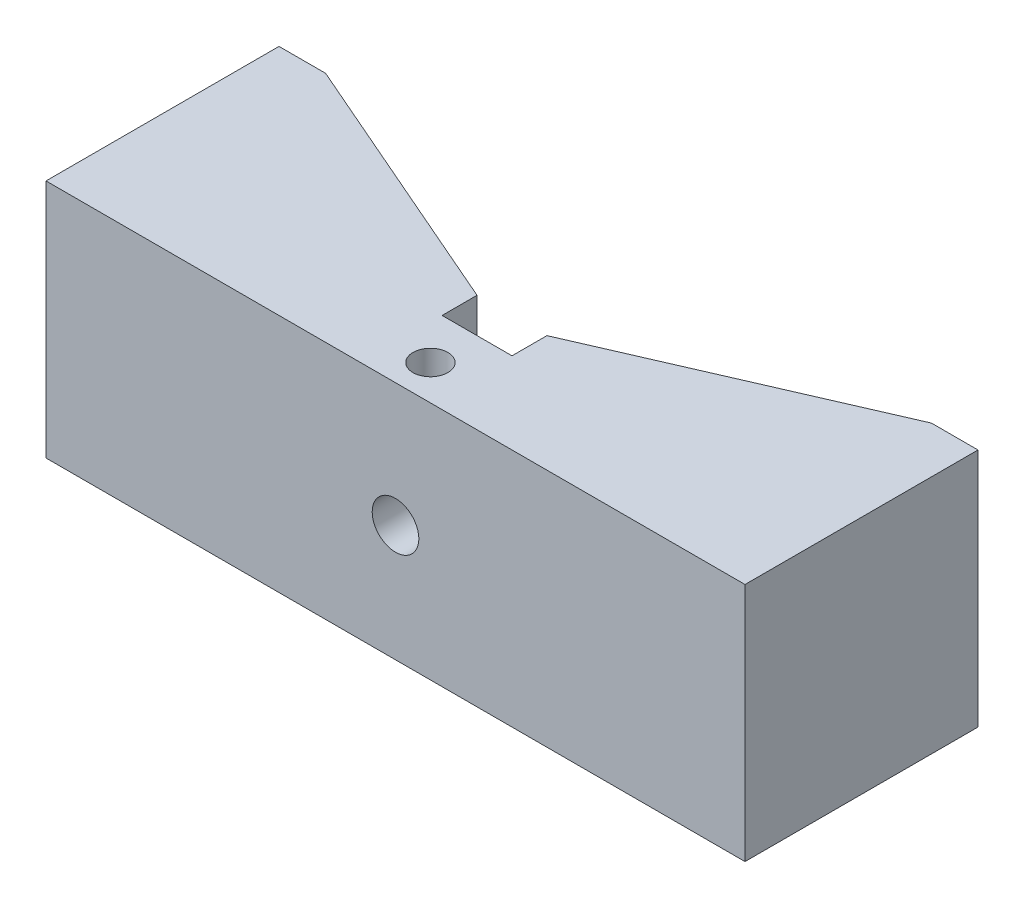
ISO-10303-21;
HEADER;
FILE_DESCRIPTION(('STEP AP214'),'2;1');
FILE_NAME('part.step','',(''),(''),'','','');
FILE_SCHEMA(('AUTOMOTIVE_DESIGN { 1 0 10303 214 1 1 1 1 }'));
ENDSEC;
DATA;
#1=APPLICATION_CONTEXT('core data for automotive mechanical design processes');
#2=APPLICATION_PROTOCOL_DEFINITION('international standard','automotive_design',2000,#1);
#3=PRODUCT_CONTEXT('',#1,'mechanical');
#4=PRODUCT('Part','Part','',(#3));
#5=PRODUCT_RELATED_PRODUCT_CATEGORY('part','',(#4));
#6=PRODUCT_DEFINITION_FORMATION('','',#4);
#7=PRODUCT_DEFINITION_CONTEXT('part definition',#1,'design');
#8=PRODUCT_DEFINITION('design','',#6,#7);
#9=PRODUCT_DEFINITION_SHAPE('','',#8);
#10=(LENGTH_UNIT() NAMED_UNIT(*) SI_UNIT(.MILLI.,.METRE.));
#11=(NAMED_UNIT(*) PLANE_ANGLE_UNIT() SI_UNIT($,.RADIAN.));
#12=(NAMED_UNIT(*) SI_UNIT($,.STERADIAN.) SOLID_ANGLE_UNIT());
#13=UNCERTAINTY_MEASURE_WITH_UNIT(LENGTH_MEASURE(1.E-05),#10,'distance_accuracy_value','');
#14=(GEOMETRIC_REPRESENTATION_CONTEXT(3) GLOBAL_UNCERTAINTY_ASSIGNED_CONTEXT((#13)) GLOBAL_UNIT_ASSIGNED_CONTEXT((#10,
#11,#12)) REPRESENTATION_CONTEXT('',''));
#15=CARTESIAN_POINT('',(0.,0.,0.));
#16=DIRECTION('',(0.,0.,1.));
#17=DIRECTION('',(1.,0.,0.));
#18=AXIS2_PLACEMENT_3D('',#15,#16,#17);
#19=CARTESIAN_POINT('',(-33.02,26.162,-12.7));
#20=DIRECTION('',(0.,0.,1.));
#21=DIRECTION('',(1.,0.,0.));
#22=AXIS2_PLACEMENT_3D('',#19,#20,#21);
#23=PLANE('',#22);
#24=DIRECTION('',(-1.,0.,0.));
#25=VECTOR('',#24,1.);
#26=CARTESIAN_POINT('',(-33.02,0.,-12.7));
#27=LINE('',#26,#25);
#28=CARTESIAN_POINT('',(-33.02,0.,-12.7));
#29=VERTEX_POINT('',#28);
#30=CARTESIAN_POINT('',(-38.1,0.,-12.7));
#31=VERTEX_POINT('',#30);
#32=EDGE_CURVE('E140',#29,#31,#27,.T.);
#33=ORIENTED_EDGE('',*,*,#32,.T.);
#34=DIRECTION('',(0.,-1.,0.));
#35=VECTOR('',#34,1.);
#36=CARTESIAN_POINT('',(-38.1,26.162,-12.7));
#37=LINE('',#36,#35);
#38=CARTESIAN_POINT('',(-38.1,26.162,-12.7));
#39=VERTEX_POINT('',#38);
#40=EDGE_CURVE('E11',#39,#31,#37,.T.);
#41=ORIENTED_EDGE('',*,*,#40,.F.);
#42=DIRECTION('',(-1.,0.,0.));
#43=VECTOR('',#42,1.);
#44=CARTESIAN_POINT('',(-33.02,26.162,-12.7));
#45=LINE('',#44,#43);
#46=CARTESIAN_POINT('',(-33.02,26.162,-12.7));
#47=VERTEX_POINT('',#46);
#48=EDGE_CURVE('E159',#47,#39,#45,.T.);
#49=ORIENTED_EDGE('',*,*,#48,.F.);
#50=DIRECTION('',(0.,-1.,0.));
#51=VECTOR('',#50,1.);
#52=CARTESIAN_POINT('',(-33.02,26.162,-12.7));
#53=LINE('',#52,#51);
#54=EDGE_CURVE('E136',#47,#29,#53,.T.);
#55=ORIENTED_EDGE('',*,*,#54,.T.);
#56=EDGE_LOOP('',(#33,#41,#49,#55));
#57=FACE_BOUND('',#56,.T.);
#58=ADVANCED_FACE('F32',(#57),#23,.F.);
#59=CARTESIAN_POINT('',(-38.1,26.162,12.7));
#60=DIRECTION('',(1.,0.,0.));
#61=DIRECTION('',(0.,0.,-1.));
#62=AXIS2_PLACEMENT_3D('',#59,#60,#61);
#63=PLANE('',#62);
#64=DIRECTION('',(0.,0.,1.));
#65=VECTOR('',#64,1.);
#66=CARTESIAN_POINT('',(-38.1,0.,12.7));
#67=LINE('',#66,#65);
#68=CARTESIAN_POINT('',(-38.1,0.,12.7));
#69=VERTEX_POINT('',#68);
#70=EDGE_CURVE('E143',#31,#69,#67,.T.);
#71=ORIENTED_EDGE('',*,*,#70,.T.);
#72=DIRECTION('',(0.,-1.,0.));
#73=VECTOR('',#72,1.);
#74=CARTESIAN_POINT('',(-38.1,26.162,12.7));
#75=LINE('',#74,#73);
#76=CARTESIAN_POINT('',(-38.1,26.162,12.7));
#77=VERTEX_POINT('',#76);
#78=EDGE_CURVE('E40',#77,#69,#75,.T.);
#79=ORIENTED_EDGE('',*,*,#78,.F.);
#80=DIRECTION('',(0.,0.,1.));
#81=VECTOR('',#80,1.);
#82=CARTESIAN_POINT('',(-38.1,26.162,12.7));
#83=LINE('',#82,#81);
#84=EDGE_CURVE('E97',#39,#77,#83,.T.);
#85=ORIENTED_EDGE('',*,*,#84,.F.);
#86=ORIENTED_EDGE('',*,*,#40,.T.);
#87=EDGE_LOOP('',(#71,#79,#85,#86));
#88=FACE_BOUND('',#87,.T.);
#89=ADVANCED_FACE('F239',(#88),#63,.F.);
#90=CARTESIAN_POINT('',(38.1,26.162,12.7));
#91=DIRECTION('',(0.,0.,-1.));
#92=DIRECTION('',(-1.,0.,0.));
#93=AXIS2_PLACEMENT_3D('',#90,#91,#92);
#94=PLANE('',#93);
#95=CARTESIAN_POINT('',(0.,12.7,12.7));
#96=DIRECTION('',(0.,0.,-1.));
#97=DIRECTION('',(-1.,0.,0.));
#98=AXIS2_PLACEMENT_3D('',#95,#96,#97);
#99=CIRCLE('',#98,2.54);
#100=CARTESIAN_POINT('',(-2.54,12.7,12.7));
#101=VERTEX_POINT('',#100);
#102=EDGE_CURVE('E209',#101,#101,#99,.T.);
#103=ORIENTED_EDGE('',*,*,#102,.T.);
#104=EDGE_LOOP('',(#103));
#105=FACE_BOUND('',#104,.T.);
#106=DIRECTION('',(1.,0.,0.));
#107=VECTOR('',#106,1.);
#108=CARTESIAN_POINT('',(38.1,0.,12.7));
#109=LINE('',#108,#107);
#110=CARTESIAN_POINT('',(38.1,0.,12.7));
#111=VERTEX_POINT('',#110);
#112=EDGE_CURVE('E146',#69,#111,#109,.T.);
#113=ORIENTED_EDGE('',*,*,#112,.T.);
#114=DIRECTION('',(0.,-1.,0.));
#115=VECTOR('',#114,1.);
#116=CARTESIAN_POINT('',(38.1,26.162,12.7));
#117=LINE('',#116,#115);
#118=CARTESIAN_POINT('',(38.1,26.162,12.7));
#119=VERTEX_POINT('',#118);
#120=EDGE_CURVE('E172',#119,#111,#117,.T.);
#121=ORIENTED_EDGE('',*,*,#120,.F.);
#122=DIRECTION('',(1.,0.,0.));
#123=VECTOR('',#122,1.);
#124=CARTESIAN_POINT('',(38.1,26.162,12.7));
#125=LINE('',#124,#123);
#126=EDGE_CURVE('E180',#77,#119,#125,.T.);
#127=ORIENTED_EDGE('',*,*,#126,.F.);
#128=ORIENTED_EDGE('',*,*,#78,.T.);
#129=EDGE_LOOP('',(#113,#121,#127,#128));
#130=FACE_BOUND('',#129,.T.);
#131=ADVANCED_FACE('F178',(#105,#130),#94,.F.);
#132=CARTESIAN_POINT('',(38.1,26.162,12.7));
#133=DIRECTION('',(-1.,0.,0.));
#134=DIRECTION('',(0.,0.,1.));
#135=AXIS2_PLACEMENT_3D('',#132,#133,#134);
#136=PLANE('',#135);
#137=DIRECTION('',(0.,0.,-1.));
#138=VECTOR('',#137,1.);
#139=CARTESIAN_POINT('',(38.1,0.,12.7));
#140=LINE('',#139,#138);
#141=CARTESIAN_POINT('',(38.1,0.,-12.7));
#142=VERTEX_POINT('',#141);
#143=EDGE_CURVE('E148',#111,#142,#140,.T.);
#144=ORIENTED_EDGE('',*,*,#143,.T.);
#145=DIRECTION('',(0.,-1.,0.));
#146=VECTOR('',#145,1.);
#147=CARTESIAN_POINT('',(38.1,26.162,-12.7));
#148=LINE('',#147,#146);
#149=CARTESIAN_POINT('',(38.1,26.162,-12.7));
#150=VERTEX_POINT('',#149);
#151=EDGE_CURVE('E169',#150,#142,#148,.T.);
#152=ORIENTED_EDGE('',*,*,#151,.F.);
#153=DIRECTION('',(0.,0.,-1.));
#154=VECTOR('',#153,1.);
#155=CARTESIAN_POINT('',(38.1,26.162,12.7));
#156=LINE('',#155,#154);
#157=EDGE_CURVE('E198',#119,#150,#156,.T.);
#158=ORIENTED_EDGE('',*,*,#157,.F.);
#159=ORIENTED_EDGE('',*,*,#120,.T.);
#160=EDGE_LOOP('',(#144,#152,#158,#159));
#161=FACE_BOUND('',#160,.T.);
#162=ADVANCED_FACE('F189',(#161),#136,.F.);
#163=CARTESIAN_POINT('',(38.1,26.162,-12.7));
#164=DIRECTION('',(0.,0.,1.));
#165=DIRECTION('',(1.,0.,0.));
#166=AXIS2_PLACEMENT_3D('',#163,#164,#165);
#167=PLANE('',#166);
#168=DIRECTION('',(-1.,0.,0.));
#169=VECTOR('',#168,1.);
#170=CARTESIAN_POINT('',(38.1,0.,-12.7));
#171=LINE('',#170,#169);
#172=CARTESIAN_POINT('',(33.02,0.,-12.7));
#173=VERTEX_POINT('',#172);
#174=EDGE_CURVE('E150',#142,#173,#171,.T.);
#175=ORIENTED_EDGE('',*,*,#174,.T.);
#176=DIRECTION('',(0.,-1.,0.));
#177=VECTOR('',#176,1.);
#178=CARTESIAN_POINT('',(33.02,26.162,-12.7));
#179=LINE('',#178,#177);
#180=CARTESIAN_POINT('',(33.02,26.162,-12.7));
#181=VERTEX_POINT('',#180);
#182=EDGE_CURVE('E166',#181,#173,#179,.T.);
#183=ORIENTED_EDGE('',*,*,#182,.F.);
#184=DIRECTION('',(-1.,0.,0.));
#185=VECTOR('',#184,1.);
#186=CARTESIAN_POINT('',(38.1,26.162,-12.7));
#187=LINE('',#186,#185);
#188=EDGE_CURVE('E195',#150,#181,#187,.T.);
#189=ORIENTED_EDGE('',*,*,#188,.F.);
#190=ORIENTED_EDGE('',*,*,#151,.T.);
#191=EDGE_LOOP('',(#175,#183,#189,#190));
#192=FACE_BOUND('',#191,.T.);
#193=ADVANCED_FACE('F193',(#192),#167,.F.);
#194=CARTESIAN_POINT('',(33.02,26.162,-12.7));
#195=DIRECTION('',(0.39872611141445,0.,0.917070056253235));
#196=DIRECTION('',(0.917070056253235,0.,-0.39872611141445));
#197=AXIS2_PLACEMENT_3D('',#194,#195,#196);
#198=PLANE('',#197);
#199=DIRECTION('',(-0.917070056253235,0.,0.39872611141445));
#200=VECTOR('',#199,1.);
#201=CARTESIAN_POINT('',(33.02,0.,-12.7));
#202=LINE('',#201,#200);
#203=CARTESIAN_POINT('',(3.81000000000001,0.,0.));
#204=VERTEX_POINT('',#203);
#205=EDGE_CURVE('E152',#173,#204,#202,.T.);
#206=ORIENTED_EDGE('',*,*,#205,.T.);
#207=DIRECTION('',(0.,-1.,0.));
#208=VECTOR('',#207,1.);
#209=CARTESIAN_POINT('',(3.81000000000001,26.162,0.));
#210=LINE('',#209,#208);
#211=CARTESIAN_POINT('',(3.81000000000001,26.162,0.));
#212=VERTEX_POINT('',#211);
#213=EDGE_CURVE('E163',#212,#204,#210,.T.);
#214=ORIENTED_EDGE('',*,*,#213,.F.);
#215=DIRECTION('',(-0.917070056253235,0.,0.39872611141445));
#216=VECTOR('',#215,1.);
#217=CARTESIAN_POINT('',(33.02,26.162,-12.7));
#218=LINE('',#217,#216);
#219=EDGE_CURVE('E197',#181,#212,#218,.T.);
#220=ORIENTED_EDGE('',*,*,#219,.F.);
#221=ORIENTED_EDGE('',*,*,#182,.T.);
#222=EDGE_LOOP('',(#206,#214,#220,#221));
#223=FACE_BOUND('',#222,.T.);
#224=ADVANCED_FACE('F235',(#223),#198,.F.);
#225=CARTESIAN_POINT('',(3.81,26.162,3.81));
#226=DIRECTION('',(1.,0.,0.));
#227=DIRECTION('',(0.,0.,-1.));
#228=AXIS2_PLACEMENT_3D('',#225,#226,#227);
#229=PLANE('',#228);
#230=DIRECTION('',(0.,0.,1.));
#231=VECTOR('',#230,1.);
#232=CARTESIAN_POINT('',(3.81,0.,3.81));
#233=LINE('',#232,#231);
#234=CARTESIAN_POINT('',(3.81,0.,3.81));
#235=VERTEX_POINT('',#234);
#236=EDGE_CURVE('E154',#204,#235,#233,.T.);
#237=ORIENTED_EDGE('',*,*,#236,.T.);
#238=DIRECTION('',(0.,-1.,0.));
#239=VECTOR('',#238,1.);
#240=CARTESIAN_POINT('',(3.81,26.162,3.81));
#241=LINE('',#240,#239);
#242=CARTESIAN_POINT('',(3.81,26.162,3.81));
#243=VERTEX_POINT('',#242);
#244=EDGE_CURVE('E131',#243,#235,#241,.T.);
#245=ORIENTED_EDGE('',*,*,#244,.F.);
#246=DIRECTION('',(0.,0.,1.));
#247=VECTOR('',#246,1.);
#248=CARTESIAN_POINT('',(3.81,26.162,3.81));
#249=LINE('',#248,#247);
#250=EDGE_CURVE('E122',#212,#243,#249,.T.);
#251=ORIENTED_EDGE('',*,*,#250,.F.);
#252=ORIENTED_EDGE('',*,*,#213,.T.);
#253=EDGE_LOOP('',(#237,#245,#251,#252));
#254=FACE_BOUND('',#253,.T.);
#255=ADVANCED_FACE('F227',(#254),#229,.F.);
#256=CARTESIAN_POINT('',(-3.81,26.162,3.81));
#257=DIRECTION('',(0.,0.,1.));
#258=DIRECTION('',(1.,0.,0.));
#259=AXIS2_PLACEMENT_3D('',#256,#257,#258);
#260=PLANE('',#259);
#261=CARTESIAN_POINT('',(0.,12.7,3.81));
#262=DIRECTION('',(0.,0.,-1.));
#263=DIRECTION('',(-1.,0.,0.));
#264=AXIS2_PLACEMENT_3D('',#261,#262,#263);
#265=CIRCLE('',#264,2.54);
#266=CARTESIAN_POINT('',(-2.54,12.7,3.81));
#267=VERTEX_POINT('',#266);
#268=EDGE_CURVE('E212',#267,#267,#265,.T.);
#269=ORIENTED_EDGE('',*,*,#268,.F.);
#270=EDGE_LOOP('',(#269));
#271=FACE_BOUND('',#270,.T.);
#272=DIRECTION('',(-1.,0.,0.));
#273=VECTOR('',#272,1.);
#274=CARTESIAN_POINT('',(-3.81,0.,3.81));
#275=LINE('',#274,#273);
#276=CARTESIAN_POINT('',(-3.81,0.,3.81));
#277=VERTEX_POINT('',#276);
#278=EDGE_CURVE('E130',#235,#277,#275,.T.);
#279=ORIENTED_EDGE('',*,*,#278,.T.);
#280=DIRECTION('',(0.,-1.,0.));
#281=VECTOR('',#280,1.);
#282=CARTESIAN_POINT('',(-3.81,26.162,3.81));
#283=LINE('',#282,#281);
#284=CARTESIAN_POINT('',(-3.81,26.162,3.81));
#285=VERTEX_POINT('',#284);
#286=EDGE_CURVE('E127',#285,#277,#283,.T.);
#287=ORIENTED_EDGE('',*,*,#286,.F.);
#288=DIRECTION('',(-1.,0.,0.));
#289=VECTOR('',#288,1.);
#290=CARTESIAN_POINT('',(-3.81,26.162,3.81));
#291=LINE('',#290,#289);
#292=EDGE_CURVE('E116',#243,#285,#291,.T.);
#293=ORIENTED_EDGE('',*,*,#292,.F.);
#294=ORIENTED_EDGE('',*,*,#244,.T.);
#295=EDGE_LOOP('',(#279,#287,#293,#294));
#296=FACE_BOUND('',#295,.T.);
#297=ADVANCED_FACE('F128',(#271,#296),#260,.F.);
#298=CARTESIAN_POINT('',(-3.81,26.162,0.));
#299=DIRECTION('',(-1.,0.,0.));
#300=DIRECTION('',(0.,0.,1.));
#301=AXIS2_PLACEMENT_3D('',#298,#299,#300);
#302=PLANE('',#301);
#303=DIRECTION('',(0.,0.,-1.));
#304=VECTOR('',#303,1.);
#305=CARTESIAN_POINT('',(-3.81,0.,0.));
#306=LINE('',#305,#304);
#307=CARTESIAN_POINT('',(-3.81,0.,0.));
#308=VERTEX_POINT('',#307);
#309=EDGE_CURVE('E83',#277,#308,#306,.T.);
#310=ORIENTED_EDGE('',*,*,#309,.T.);
#311=DIRECTION('',(0.,-1.,0.));
#312=VECTOR('',#311,1.);
#313=CARTESIAN_POINT('',(-3.81,26.162,0.));
#314=LINE('',#313,#312);
#315=CARTESIAN_POINT('',(-3.81,26.162,0.));
#316=VERTEX_POINT('',#315);
#317=EDGE_CURVE('E132',#316,#308,#314,.T.);
#318=ORIENTED_EDGE('',*,*,#317,.F.);
#319=DIRECTION('',(0.,0.,-1.));
#320=VECTOR('',#319,1.);
#321=CARTESIAN_POINT('',(-3.81,26.162,0.));
#322=LINE('',#321,#320);
#323=EDGE_CURVE('E120',#285,#316,#322,.T.);
#324=ORIENTED_EDGE('',*,*,#323,.F.);
#325=ORIENTED_EDGE('',*,*,#286,.T.);
#326=EDGE_LOOP('',(#310,#318,#324,#325));
#327=FACE_BOUND('',#326,.T.);
#328=ADVANCED_FACE('F134',(#327),#302,.F.);
#329=CARTESIAN_POINT('',(-33.02,26.162,-12.7));
#330=DIRECTION('',(-0.39872611141445,0.,0.917070056253235));
#331=DIRECTION('',(0.917070056253235,0.,0.39872611141445));
#332=AXIS2_PLACEMENT_3D('',#329,#330,#331);
#333=PLANE('',#332);
#334=DIRECTION('',(-0.917070056253235,0.,-0.39872611141445));
#335=VECTOR('',#334,1.);
#336=CARTESIAN_POINT('',(-33.02,0.,-12.7));
#337=LINE('',#336,#335);
#338=EDGE_CURVE('E89',#308,#29,#337,.T.);
#339=ORIENTED_EDGE('',*,*,#338,.T.);
#340=ORIENTED_EDGE('',*,*,#54,.F.);
#341=DIRECTION('',(-0.917070056253235,0.,-0.39872611141445));
#342=VECTOR('',#341,1.);
#343=CARTESIAN_POINT('',(-33.02,26.162,-12.7));
#344=LINE('',#343,#342);
#345=EDGE_CURVE('E48',#316,#47,#344,.T.);
#346=ORIENTED_EDGE('',*,*,#345,.F.);
#347=ORIENTED_EDGE('',*,*,#317,.T.);
#348=EDGE_LOOP('',(#339,#340,#346,#347));
#349=FACE_BOUND('',#348,.T.);
#350=ADVANCED_FACE('F233',(#349),#333,.F.);
#351=CARTESIAN_POINT('',(0.,26.162,0.));
#352=DIRECTION('',(0.,-1.,0.));
#353=DIRECTION('',(0.,0.,-1.));
#354=AXIS2_PLACEMENT_3D('',#351,#352,#353);
#355=PLANE('',#354);
#356=CARTESIAN_POINT('',(0.,26.162,8.89));
#357=DIRECTION('',(0.,1.,0.));
#358=DIRECTION('',(0.,0.,1.));
#359=AXIS2_PLACEMENT_3D('',#356,#357,#358);
#360=CIRCLE('',#359,1.905);
#361=CARTESIAN_POINT('',(0.,26.162,10.795));
#362=VERTEX_POINT('',#361);
#363=EDGE_CURVE('E206',#362,#362,#360,.T.);
#364=ORIENTED_EDGE('',*,*,#363,.F.);
#365=EDGE_LOOP('',(#364));
#366=FACE_BOUND('',#365,.T.);
#367=ORIENTED_EDGE('',*,*,#48,.T.);
#368=ORIENTED_EDGE('',*,*,#84,.T.);
#369=ORIENTED_EDGE('',*,*,#126,.T.);
#370=ORIENTED_EDGE('',*,*,#157,.T.);
#371=ORIENTED_EDGE('',*,*,#188,.T.);
#372=ORIENTED_EDGE('',*,*,#219,.T.);
#373=ORIENTED_EDGE('',*,*,#250,.T.);
#374=ORIENTED_EDGE('',*,*,#292,.T.);
#375=ORIENTED_EDGE('',*,*,#323,.T.);
#376=ORIENTED_EDGE('',*,*,#345,.T.);
#377=EDGE_LOOP('',(#367,#368,#369,#370,#371,#372,#373,#374,#375,#376));
#378=FACE_BOUND('',#377,.T.);
#379=ADVANCED_FACE('F118',(#366,#378),#355,.F.);
#380=CARTESIAN_POINT('',(0.,0.,0.));
#381=DIRECTION('',(0.,-1.,0.));
#382=DIRECTION('',(0.,0.,-1.));
#383=AXIS2_PLACEMENT_3D('',#380,#381,#382);
#384=PLANE('',#383);
#385=ORIENTED_EDGE('',*,*,#32,.F.);
#386=ORIENTED_EDGE('',*,*,#338,.F.);
#387=ORIENTED_EDGE('',*,*,#309,.F.);
#388=ORIENTED_EDGE('',*,*,#278,.F.);
#389=ORIENTED_EDGE('',*,*,#236,.F.);
#390=ORIENTED_EDGE('',*,*,#205,.F.);
#391=ORIENTED_EDGE('',*,*,#174,.F.);
#392=ORIENTED_EDGE('',*,*,#143,.F.);
#393=ORIENTED_EDGE('',*,*,#112,.F.);
#394=ORIENTED_EDGE('',*,*,#70,.F.);
#395=EDGE_LOOP('',(#385,#386,#387,#388,#389,#390,#391,#392,#393,#394));
#396=FACE_BOUND('',#395,.T.);
#397=ADVANCED_FACE('F184',(#396),#384,.T.);
#398=CARTESIAN_POINT('',(0.,21.082,8.89));
#399=DIRECTION('',(0.,1.,0.));
#400=DIRECTION('',(0.,0.,1.));
#401=AXIS2_PLACEMENT_3D('',#398,#399,#400);
#402=CYLINDRICAL_SURFACE('',#401,1.905);
#403=CARTESIAN_POINT('',(0.,21.082,8.89));
#404=DIRECTION('',(0.,1.,0.));
#405=DIRECTION('',(0.,0.,1.));
#406=AXIS2_PLACEMENT_3D('',#403,#404,#405);
#407=CIRCLE('',#406,1.905);
#408=CARTESIAN_POINT('',(0.,21.082,10.795));
#409=VERTEX_POINT('',#408);
#410=EDGE_CURVE('E144',#409,#409,#407,.T.);
#411=ORIENTED_EDGE('',*,*,#410,.F.);
#412=EDGE_LOOP('',(#411));
#413=FACE_BOUND('',#412,.T.);
#414=ORIENTED_EDGE('',*,*,#363,.T.);
#415=EDGE_LOOP('',(#414));
#416=FACE_BOUND('',#415,.T.);
#417=ADVANCED_FACE('F308',(#413,#416),#402,.F.);
#418=CARTESIAN_POINT('',(0.,21.082,8.89));
#419=DIRECTION('',(0.,1.,0.));
#420=DIRECTION('',(0.,0.,1.));
#421=AXIS2_PLACEMENT_3D('',#418,#419,#420);
#422=PLANE('',#421);
#423=ORIENTED_EDGE('',*,*,#410,.T.);
#424=EDGE_LOOP('',(#423));
#425=FACE_BOUND('',#424,.T.);
#426=ADVANCED_FACE('F222',(#425),#422,.T.);
#427=CARTESIAN_POINT('',(0.,12.7,12.7));
#428=DIRECTION('',(0.,0.,-1.));
#429=DIRECTION('',(-1.,0.,0.));
#430=AXIS2_PLACEMENT_3D('',#427,#428,#429);
#431=CYLINDRICAL_SURFACE('',#430,2.54);
#432=ORIENTED_EDGE('',*,*,#102,.F.);
#433=EDGE_LOOP('',(#432));
#434=FACE_BOUND('',#433,.T.);
#435=ORIENTED_EDGE('',*,*,#268,.T.);
#436=EDGE_LOOP('',(#435));
#437=FACE_BOUND('',#436,.T.);
#438=ADVANCED_FACE('F219',(#434,#437),#431,.F.);
#439=CLOSED_SHELL('',(#58,#89,#131,#162,#193,#224,#255,#297,#328,#350,#379,#397,#417,#426,#438));
#440=MANIFOLD_SOLID_BREP('B2',#439);
#441=ADVANCED_BREP_SHAPE_REPRESENTATION('',(#18,#440),#14);
#442=SHAPE_DEFINITION_REPRESENTATION(#9,#441);
ENDSEC;
END-ISO-10303-21;
